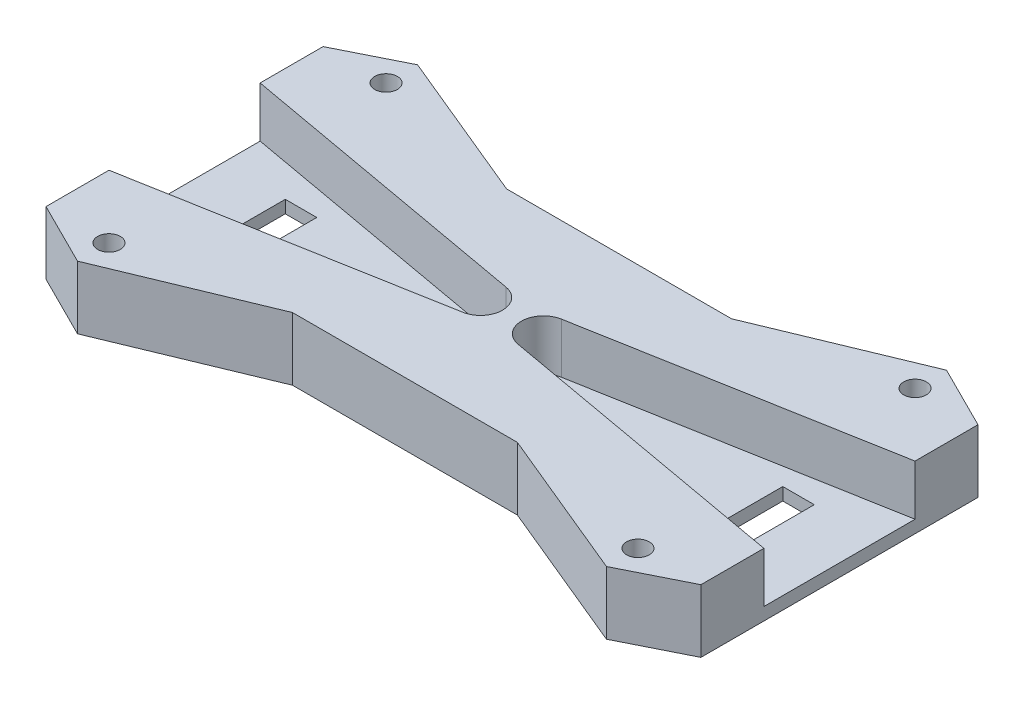
ISO-10303-21;
HEADER;
FILE_DESCRIPTION(('STEP AP214'),'2;1');
FILE_NAME('part.step','',(''),(''),'','','');
FILE_SCHEMA(('AUTOMOTIVE_DESIGN { 1 0 10303 214 1 1 1 1 }'));
ENDSEC;
DATA;
#1=APPLICATION_CONTEXT('core data for automotive mechanical design processes');
#2=APPLICATION_PROTOCOL_DEFINITION('international standard','automotive_design',2000,#1);
#3=PRODUCT_CONTEXT('',#1,'mechanical');
#4=PRODUCT('Part','Part','',(#3));
#5=PRODUCT_RELATED_PRODUCT_CATEGORY('part','',(#4));
#6=PRODUCT_DEFINITION_FORMATION('','',#4);
#7=PRODUCT_DEFINITION_CONTEXT('part definition',#1,'design');
#8=PRODUCT_DEFINITION('design','',#6,#7);
#9=PRODUCT_DEFINITION_SHAPE('','',#8);
#10=(LENGTH_UNIT() NAMED_UNIT(*) SI_UNIT(.MILLI.,.METRE.));
#11=(NAMED_UNIT(*) PLANE_ANGLE_UNIT() SI_UNIT($,.RADIAN.));
#12=(NAMED_UNIT(*) SI_UNIT($,.STERADIAN.) SOLID_ANGLE_UNIT());
#13=UNCERTAINTY_MEASURE_WITH_UNIT(LENGTH_MEASURE(1.E-05),#10,'distance_accuracy_value','');
#14=(GEOMETRIC_REPRESENTATION_CONTEXT(3) GLOBAL_UNCERTAINTY_ASSIGNED_CONTEXT((#13)) GLOBAL_UNIT_ASSIGNED_CONTEXT((#10,
#11,#12)) REPRESENTATION_CONTEXT('',''));
#15=CARTESIAN_POINT('',(0.,0.,0.));
#16=DIRECTION('',(0.,0.,1.));
#17=DIRECTION('',(1.,0.,0.));
#18=AXIS2_PLACEMENT_3D('',#15,#16,#17);
#19=CARTESIAN_POINT('',(-19.2,10.,38.4));
#20=DIRECTION('',(0.447213595499958,0.,-0.894427190999916));
#21=DIRECTION('',(-0.894427190999916,0.,-0.447213595499958));
#22=AXIS2_PLACEMENT_3D('',#19,#20,#21);
#23=PLANE('',#22);
#24=DIRECTION('',(0.894427190999916,0.,0.447213595499958));
#25=VECTOR('',#24,1.);
#26=CARTESIAN_POINT('',(-19.2,0.,38.4));
#27=LINE('',#26,#25);
#28=CARTESIAN_POINT('',(-52.,0.,22.));
#29=VERTEX_POINT('',#28);
#30=CARTESIAN_POINT('',(-42.,0.,27.));
#31=VERTEX_POINT('',#30);
#32=EDGE_CURVE('E341',#29,#31,#27,.T.);
#33=ORIENTED_EDGE('',*,*,#32,.T.);
#34=DIRECTION('',(0.,-1.,0.));
#35=VECTOR('',#34,1.);
#36=CARTESIAN_POINT('',(-42.,10.,27.));
#37=LINE('',#36,#35);
#38=CARTESIAN_POINT('',(-42.,10.,27.));
#39=VERTEX_POINT('',#38);
#40=EDGE_CURVE('E11',#39,#31,#37,.T.);
#41=ORIENTED_EDGE('',*,*,#40,.F.);
#42=DIRECTION('',(0.894427190999916,0.,0.447213595499958));
#43=VECTOR('',#42,1.);
#44=CARTESIAN_POINT('',(-19.2,10.,38.4));
#45=LINE('',#44,#43);
#46=CARTESIAN_POINT('',(-52.,10.,22.));
#47=VERTEX_POINT('',#46);
#48=EDGE_CURVE('E387',#47,#39,#45,.T.);
#49=ORIENTED_EDGE('',*,*,#48,.F.);
#50=DIRECTION('',(0.,-1.,0.));
#51=VECTOR('',#50,1.);
#52=CARTESIAN_POINT('',(-52.,10.,22.));
#53=LINE('',#52,#51);
#54=EDGE_CURVE('E388',#47,#29,#53,.T.);
#55=ORIENTED_EDGE('',*,*,#54,.T.);
#56=EDGE_LOOP('',(#33,#41,#49,#55));
#57=FACE_BOUND('',#56,.T.);
#58=ADVANCED_FACE('F47',(#57),#23,.F.);
#59=CARTESIAN_POINT('',(3.39518395093588,10.,8.19669914110084));
#60=DIRECTION('',(-0.382683432365091,0.,-0.923879532511286));
#61=DIRECTION('',(-0.923879532511287,0.,0.382683432365091));
#62=AXIS2_PLACEMENT_3D('',#59,#60,#61);
#63=PLANE('',#62);
#64=DIRECTION('',(0.923879532511286,0.,-0.382683432365091));
#65=VECTOR('',#64,1.);
#66=CARTESIAN_POINT('',(3.39518395093588,0.,8.19669914110084));
#67=LINE('',#66,#65);
#68=CARTESIAN_POINT('',(-17.8578643762691,0.,17.));
#69=VERTEX_POINT('',#68);
#70=EDGE_CURVE('E331',#31,#69,#67,.T.);
#71=ORIENTED_EDGE('',*,*,#70,.T.);
#72=DIRECTION('',(0.,-1.,0.));
#73=VECTOR('',#72,1.);
#74=CARTESIAN_POINT('',(-17.8578643762691,10.,17.));
#75=LINE('',#74,#73);
#76=CARTESIAN_POINT('',(-17.8578643762691,10.,17.));
#77=VERTEX_POINT('',#76);
#78=EDGE_CURVE('E55',#77,#69,#75,.T.);
#79=ORIENTED_EDGE('',*,*,#78,.F.);
#80=DIRECTION('',(0.923879532511286,0.,-0.382683432365091));
#81=VECTOR('',#80,1.);
#82=CARTESIAN_POINT('',(3.39518395093588,10.,8.19669914110084));
#83=LINE('',#82,#81);
#84=EDGE_CURVE('E451',#39,#77,#83,.T.);
#85=ORIENTED_EDGE('',*,*,#84,.F.);
#86=ORIENTED_EDGE('',*,*,#40,.T.);
#87=EDGE_LOOP('',(#71,#79,#85,#86));
#88=FACE_BOUND('',#87,.T.);
#89=ADVANCED_FACE('F536',(#88),#63,.F.);
#90=CARTESIAN_POINT('',(0.,10.,17.));
#91=DIRECTION('',(0.,0.,-1.));
#92=DIRECTION('',(-1.,0.,0.));
#93=AXIS2_PLACEMENT_3D('',#90,#91,#92);
#94=PLANE('',#93);
#95=DIRECTION('',(1.,0.,0.));
#96=VECTOR('',#95,1.);
#97=CARTESIAN_POINT('',(0.,0.,17.));
#98=LINE('',#97,#96);
#99=CARTESIAN_POINT('',(17.8578643762691,0.,17.));
#100=VERTEX_POINT('',#99);
#101=EDGE_CURVE('E323',#69,#100,#98,.T.);
#102=ORIENTED_EDGE('',*,*,#101,.T.);
#103=DIRECTION('',(0.,-1.,0.));
#104=VECTOR('',#103,1.);
#105=CARTESIAN_POINT('',(17.8578643762691,10.,17.));
#106=LINE('',#105,#104);
#107=CARTESIAN_POINT('',(17.8578643762691,10.,17.));
#108=VERTEX_POINT('',#107);
#109=EDGE_CURVE('E312',#108,#100,#106,.T.);
#110=ORIENTED_EDGE('',*,*,#109,.F.);
#111=DIRECTION('',(1.,0.,0.));
#112=VECTOR('',#111,1.);
#113=CARTESIAN_POINT('',(0.,10.,17.));
#114=LINE('',#113,#112);
#115=EDGE_CURVE('E325',#77,#108,#114,.T.);
#116=ORIENTED_EDGE('',*,*,#115,.F.);
#117=ORIENTED_EDGE('',*,*,#78,.T.);
#118=EDGE_LOOP('',(#102,#110,#116,#117));
#119=FACE_BOUND('',#118,.T.);
#120=ADVANCED_FACE('F321',(#119),#94,.F.);
#121=CARTESIAN_POINT('',(-3.39518395093588,10.,8.19669914110084));
#122=DIRECTION('',(-0.382683432365091,0.,0.923879532511286));
#123=DIRECTION('',(0.923879532511287,0.,0.382683432365091));
#124=AXIS2_PLACEMENT_3D('',#121,#122,#123);
#125=PLANE('',#124);
#126=DIRECTION('',(-0.923879532511286,0.,-0.382683432365091));
#127=VECTOR('',#126,1.);
#128=CARTESIAN_POINT('',(-3.39518395093588,0.,8.19669914110084));
#129=LINE('',#128,#127);
#130=CARTESIAN_POINT('',(42.,0.,27.));
#131=VERTEX_POINT('',#130);
#132=EDGE_CURVE('E334',#131,#100,#129,.T.);
#133=ORIENTED_EDGE('',*,*,#132,.F.);
#134=DIRECTION('',(0.,-1.,0.));
#135=VECTOR('',#134,1.);
#136=CARTESIAN_POINT('',(42.,10.,27.));
#137=LINE('',#136,#135);
#138=CARTESIAN_POINT('',(42.,10.,27.));
#139=VERTEX_POINT('',#138);
#140=EDGE_CURVE('E309',#139,#131,#137,.T.);
#141=ORIENTED_EDGE('',*,*,#140,.F.);
#142=DIRECTION('',(-0.923879532511286,0.,-0.382683432365091));
#143=VECTOR('',#142,1.);
#144=CARTESIAN_POINT('',(-3.39518395093588,10.,8.19669914110084));
#145=LINE('',#144,#143);
#146=EDGE_CURVE('E456',#139,#108,#145,.T.);
#147=ORIENTED_EDGE('',*,*,#146,.T.);
#148=ORIENTED_EDGE('',*,*,#109,.T.);
#149=EDGE_LOOP('',(#133,#141,#147,#148));
#150=FACE_BOUND('',#149,.T.);
#151=ADVANCED_FACE('F534',(#150),#125,.T.);
#152=CARTESIAN_POINT('',(19.2,10.,38.4));
#153=DIRECTION('',(0.447213595499958,0.,0.894427190999916));
#154=DIRECTION('',(0.894427190999916,0.,-0.447213595499958));
#155=AXIS2_PLACEMENT_3D('',#152,#153,#154);
#156=PLANE('',#155);
#157=DIRECTION('',(-0.894427190999916,0.,0.447213595499958));
#158=VECTOR('',#157,1.);
#159=CARTESIAN_POINT('',(19.2,0.,38.4));
#160=LINE('',#159,#158);
#161=CARTESIAN_POINT('',(52.,0.,22.));
#162=VERTEX_POINT('',#161);
#163=EDGE_CURVE('E339',#162,#131,#160,.T.);
#164=ORIENTED_EDGE('',*,*,#163,.F.);
#165=DIRECTION('',(0.,-1.,0.));
#166=VECTOR('',#165,1.);
#167=CARTESIAN_POINT('',(52.,10.,22.));
#168=LINE('',#167,#166);
#169=CARTESIAN_POINT('',(52.,10.,22.));
#170=VERTEX_POINT('',#169);
#171=EDGE_CURVE('E305',#170,#162,#168,.T.);
#172=ORIENTED_EDGE('',*,*,#171,.F.);
#173=DIRECTION('',(-0.894427190999916,0.,0.447213595499958));
#174=VECTOR('',#173,1.);
#175=CARTESIAN_POINT('',(19.2,10.,38.4));
#176=LINE('',#175,#174);
#177=EDGE_CURVE('E460',#170,#139,#176,.T.);
#178=ORIENTED_EDGE('',*,*,#177,.T.);
#179=ORIENTED_EDGE('',*,*,#140,.T.);
#180=EDGE_LOOP('',(#164,#172,#178,#179));
#181=FACE_BOUND('',#180,.T.);
#182=ADVANCED_FACE('F531',(#181),#156,.T.);
#183=CARTESIAN_POINT('',(-0.462556771368066,10.,2.57464029303168));
#184=DIRECTION('',(-0.176827699309656,0.,0.984241822296154));
#185=DIRECTION('',(0.984241822296154,0.,0.176827699309656));
#186=AXIS2_PLACEMENT_3D('',#183,#184,#185);
#187=PLANE('',#186);
#188=DIRECTION('',(0.,-1.,0.));
#189=VECTOR('',#188,1.);
#190=CARTESIAN_POINT('',(52.,10.,12.));
#191=LINE('',#190,#189);
#192=CARTESIAN_POINT('',(52.,10.,12.));
#193=VERTEX_POINT('',#192);
#194=CARTESIAN_POINT('',(52.,2.,12.));
#195=VERTEX_POINT('',#194);
#196=EDGE_CURVE('E62',#193,#195,#191,.T.);
#197=ORIENTED_EDGE('',*,*,#196,.T.);
#198=DIRECTION('',(-0.984241822296154,0.,-0.176827699309656));
#199=VECTOR('',#198,1.);
#200=CARTESIAN_POINT('',(-0.462556771368066,2.,2.57464029303168));
#201=LINE('',#200,#199);
#202=CARTESIAN_POINT('',(4.3811030524162,2.,3.44484637803654));
#203=VERTEX_POINT('',#202);
#204=EDGE_CURVE('E67',#195,#203,#201,.T.);
#205=ORIENTED_EDGE('',*,*,#204,.T.);
#206=DIRECTION('',(0.,-1.,0.));
#207=VECTOR('',#206,1.);
#208=CARTESIAN_POINT('',(4.3811030524162,10.,3.44484637803654));
#209=LINE('',#208,#207);
#210=CARTESIAN_POINT('',(4.3811030524162,10.,3.44484637803654));
#211=VERTEX_POINT('',#210);
#212=EDGE_CURVE('E300',#211,#203,#209,.T.);
#213=ORIENTED_EDGE('',*,*,#212,.F.);
#214=DIRECTION('',(-0.984241822296154,0.,-0.176827699309656));
#215=VECTOR('',#214,1.);
#216=CARTESIAN_POINT('',(-0.462556771368066,10.,2.57464029303168));
#217=LINE('',#216,#215);
#218=EDGE_CURVE('E467',#193,#211,#217,.T.);
#219=ORIENTED_EDGE('',*,*,#218,.F.);
#220=EDGE_LOOP('',(#197,#205,#213,#219));
#221=FACE_BOUND('',#220,.T.);
#222=ADVANCED_FACE('F550',(#221),#187,.F.);
#223=CARTESIAN_POINT('',(5.,10.,0.));
#224=DIRECTION('',(0.,-1.,0.));
#225=DIRECTION('',(0.,0.,-1.));
#226=AXIS2_PLACEMENT_3D('',#223,#224,#225);
#227=CYLINDRICAL_SURFACE('',#226,3.5);
#228=CARTESIAN_POINT('',(5.,2.,0.));
#229=DIRECTION('',(0.,1.,0.));
#230=DIRECTION('',(0.,0.,1.));
#231=AXIS2_PLACEMENT_3D('',#228,#229,#230);
#232=CIRCLE('',#231,3.5);
#233=CARTESIAN_POINT('',(4.3811030524162,2.,-3.44484637803654));
#234=VERTEX_POINT('',#233);
#235=EDGE_CURVE('E949',#234,#203,#232,.T.);
#236=ORIENTED_EDGE('',*,*,#235,.F.);
#237=DIRECTION('',(0.,-1.,0.));
#238=VECTOR('',#237,1.);
#239=CARTESIAN_POINT('',(4.3811030524162,10.,-3.44484637803654));
#240=LINE('',#239,#238);
#241=CARTESIAN_POINT('',(4.3811030524162,10.,-3.44484637803654));
#242=VERTEX_POINT('',#241);
#243=EDGE_CURVE('E296',#242,#234,#240,.T.);
#244=ORIENTED_EDGE('',*,*,#243,.F.);
#245=CARTESIAN_POINT('',(5.,10.,0.));
#246=DIRECTION('',(0.,1.,0.));
#247=DIRECTION('',(0.,0.,1.));
#248=AXIS2_PLACEMENT_3D('',#245,#246,#247);
#249=CIRCLE('',#248,3.5);
#250=EDGE_CURVE('E471',#242,#211,#249,.T.);
#251=ORIENTED_EDGE('',*,*,#250,.T.);
#252=ORIENTED_EDGE('',*,*,#212,.T.);
#253=EDGE_LOOP('',(#236,#244,#251,#252));
#254=FACE_BOUND('',#253,.T.);
#255=ADVANCED_FACE('F553',(#254),#227,.F.);
#256=CARTESIAN_POINT('',(-0.462556771368066,10.,-2.57464029303168));
#257=DIRECTION('',(0.176827699309656,0.,0.984241822296154));
#258=DIRECTION('',(0.984241822296154,0.,-0.176827699309656));
#259=AXIS2_PLACEMENT_3D('',#256,#257,#258);
#260=PLANE('',#259);
#261=DIRECTION('',(-0.984241822296154,0.,0.176827699309656));
#262=VECTOR('',#261,1.);
#263=CARTESIAN_POINT('',(-0.462556771368066,2.,-2.57464029303168));
#264=LINE('',#263,#262);
#265=CARTESIAN_POINT('',(52.,2.,-12.));
#266=VERTEX_POINT('',#265);
#267=EDGE_CURVE('E945',#266,#234,#264,.T.);
#268=ORIENTED_EDGE('',*,*,#267,.F.);
#269=DIRECTION('',(0.,-1.,0.));
#270=VECTOR('',#269,1.);
#271=CARTESIAN_POINT('',(52.,10.,-12.));
#272=LINE('',#271,#270);
#273=CARTESIAN_POINT('',(52.,10.,-12.));
#274=VERTEX_POINT('',#273);
#275=EDGE_CURVE('E292',#274,#266,#272,.T.);
#276=ORIENTED_EDGE('',*,*,#275,.F.);
#277=DIRECTION('',(-0.984241822296154,0.,0.176827699309656));
#278=VECTOR('',#277,1.);
#279=CARTESIAN_POINT('',(-0.462556771368066,10.,-2.57464029303168));
#280=LINE('',#279,#278);
#281=EDGE_CURVE('E475',#274,#242,#280,.T.);
#282=ORIENTED_EDGE('',*,*,#281,.T.);
#283=ORIENTED_EDGE('',*,*,#243,.T.);
#284=EDGE_LOOP('',(#268,#276,#282,#283));
#285=FACE_BOUND('',#284,.T.);
#286=ADVANCED_FACE('F556',(#285),#260,.T.);
#287=CARTESIAN_POINT('',(52.,10.,0.));
#288=DIRECTION('',(-1.,0.,0.));
#289=DIRECTION('',(0.,0.,1.));
#290=AXIS2_PLACEMENT_3D('',#287,#288,#289);
#291=PLANE('',#290);
#292=DIRECTION('',(0.,0.,-1.));
#293=VECTOR('',#292,1.);
#294=CARTESIAN_POINT('',(52.,0.,0.));
#295=LINE('',#294,#293);
#296=CARTESIAN_POINT('',(52.,0.,-22.));
#297=VERTEX_POINT('',#296);
#298=EDGE_CURVE('E347',#162,#297,#295,.T.);
#299=ORIENTED_EDGE('',*,*,#298,.T.);
#300=DIRECTION('',(0.,-1.,0.));
#301=VECTOR('',#300,1.);
#302=CARTESIAN_POINT('',(52.,10.,-22.));
#303=LINE('',#302,#301);
#304=CARTESIAN_POINT('',(52.,10.,-22.));
#305=VERTEX_POINT('',#304);
#306=EDGE_CURVE('E288',#305,#297,#303,.T.);
#307=ORIENTED_EDGE('',*,*,#306,.F.);
#308=DIRECTION('',(0.,0.,-1.));
#309=VECTOR('',#308,1.);
#310=CARTESIAN_POINT('',(52.,10.,0.));
#311=LINE('',#310,#309);
#312=EDGE_CURVE('E468',#274,#305,#311,.T.);
#313=ORIENTED_EDGE('',*,*,#312,.F.);
#314=ORIENTED_EDGE('',*,*,#275,.T.);
#315=DIRECTION('',(0.,0.,-1.));
#316=VECTOR('',#315,1.);
#317=CARTESIAN_POINT('',(52.,2.,0.));
#318=LINE('',#317,#316);
#319=EDGE_CURVE('E955',#195,#266,#318,.T.);
#320=ORIENTED_EDGE('',*,*,#319,.F.);
#321=ORIENTED_EDGE('',*,*,#196,.F.);
#322=EDGE_CURVE('E464',#170,#193,#311,.T.);
#323=ORIENTED_EDGE('',*,*,#322,.F.);
#324=ORIENTED_EDGE('',*,*,#171,.T.);
#325=EDGE_LOOP('',(#299,#307,#313,#314,#320,#321,#323,#324));
#326=FACE_BOUND('',#325,.T.);
#327=ADVANCED_FACE('F525',(#326),#291,.F.);
#328=CARTESIAN_POINT('',(19.2,10.,-38.4));
#329=DIRECTION('',(-0.447213595499958,0.,0.894427190999916));
#330=DIRECTION('',(0.894427190999916,0.,0.447213595499958));
#331=AXIS2_PLACEMENT_3D('',#328,#329,#330);
#332=PLANE('',#331);
#333=DIRECTION('',(-0.894427190999916,0.,-0.447213595499958));
#334=VECTOR('',#333,1.);
#335=CARTESIAN_POINT('',(19.2,0.,-38.4));
#336=LINE('',#335,#334);
#337=CARTESIAN_POINT('',(42.,0.,-27.));
#338=VERTEX_POINT('',#337);
#339=EDGE_CURVE('E350',#297,#338,#336,.T.);
#340=ORIENTED_EDGE('',*,*,#339,.T.);
#341=DIRECTION('',(0.,-1.,0.));
#342=VECTOR('',#341,1.);
#343=CARTESIAN_POINT('',(42.,10.,-27.));
#344=LINE('',#343,#342);
#345=CARTESIAN_POINT('',(42.,10.,-27.));
#346=VERTEX_POINT('',#345);
#347=EDGE_CURVE('E284',#346,#338,#344,.T.);
#348=ORIENTED_EDGE('',*,*,#347,.F.);
#349=DIRECTION('',(-0.894427190999916,0.,-0.447213595499958));
#350=VECTOR('',#349,1.);
#351=CARTESIAN_POINT('',(19.2,10.,-38.4));
#352=LINE('',#351,#350);
#353=EDGE_CURVE('E479',#305,#346,#352,.T.);
#354=ORIENTED_EDGE('',*,*,#353,.F.);
#355=ORIENTED_EDGE('',*,*,#306,.T.);
#356=EDGE_LOOP('',(#340,#348,#354,#355));
#357=FACE_BOUND('',#356,.T.);
#358=ADVANCED_FACE('F520',(#357),#332,.F.);
#359=CARTESIAN_POINT('',(-3.39518395093588,10.,-8.19669914110084));
#360=DIRECTION('',(0.382683432365091,0.,0.923879532511286));
#361=DIRECTION('',(0.923879532511287,0.,-0.382683432365091));
#362=AXIS2_PLACEMENT_3D('',#359,#360,#361);
#363=PLANE('',#362);
#364=DIRECTION('',(-0.923879532511286,0.,0.382683432365091));
#365=VECTOR('',#364,1.);
#366=CARTESIAN_POINT('',(-3.39518395093588,0.,-8.19669914110084));
#367=LINE('',#366,#365);
#368=CARTESIAN_POINT('',(17.8578643762691,0.,-17.));
#369=VERTEX_POINT('',#368);
#370=EDGE_CURVE('E353',#338,#369,#367,.T.);
#371=ORIENTED_EDGE('',*,*,#370,.T.);
#372=DIRECTION('',(0.,-1.,0.));
#373=VECTOR('',#372,1.);
#374=CARTESIAN_POINT('',(17.8578643762691,10.,-17.));
#375=LINE('',#374,#373);
#376=CARTESIAN_POINT('',(17.8578643762691,10.,-17.));
#377=VERTEX_POINT('',#376);
#378=EDGE_CURVE('E280',#377,#369,#375,.T.);
#379=ORIENTED_EDGE('',*,*,#378,.F.);
#380=DIRECTION('',(-0.923879532511286,0.,0.382683432365091));
#381=VECTOR('',#380,1.);
#382=CARTESIAN_POINT('',(-3.39518395093588,10.,-8.19669914110084));
#383=LINE('',#382,#381);
#384=EDGE_CURVE('E482',#346,#377,#383,.T.);
#385=ORIENTED_EDGE('',*,*,#384,.F.);
#386=ORIENTED_EDGE('',*,*,#347,.T.);
#387=EDGE_LOOP('',(#371,#379,#385,#386));
#388=FACE_BOUND('',#387,.T.);
#389=ADVANCED_FACE('F516',(#388),#363,.F.);
#390=CARTESIAN_POINT('',(0.,10.,-17.));
#391=DIRECTION('',(0.,0.,1.));
#392=DIRECTION('',(1.,0.,0.));
#393=AXIS2_PLACEMENT_3D('',#390,#391,#392);
#394=PLANE('',#393);
#395=DIRECTION('',(-1.,0.,0.));
#396=VECTOR('',#395,1.);
#397=CARTESIAN_POINT('',(0.,0.,-17.));
#398=LINE('',#397,#396);
#399=CARTESIAN_POINT('',(-17.8578643762691,0.,-17.));
#400=VERTEX_POINT('',#399);
#401=EDGE_CURVE('E356',#369,#400,#398,.T.);
#402=ORIENTED_EDGE('',*,*,#401,.T.);
#403=DIRECTION('',(0.,-1.,0.));
#404=VECTOR('',#403,1.);
#405=CARTESIAN_POINT('',(-17.8578643762691,10.,-17.));
#406=LINE('',#405,#404);
#407=CARTESIAN_POINT('',(-17.8578643762691,10.,-17.));
#408=VERTEX_POINT('',#407);
#409=EDGE_CURVE('E277',#408,#400,#406,.T.);
#410=ORIENTED_EDGE('',*,*,#409,.F.);
#411=DIRECTION('',(-1.,0.,0.));
#412=VECTOR('',#411,1.);
#413=CARTESIAN_POINT('',(0.,10.,-17.));
#414=LINE('',#413,#412);
#415=EDGE_CURVE('E485',#377,#408,#414,.T.);
#416=ORIENTED_EDGE('',*,*,#415,.F.);
#417=ORIENTED_EDGE('',*,*,#378,.T.);
#418=EDGE_LOOP('',(#402,#410,#416,#417));
#419=FACE_BOUND('',#418,.T.);
#420=ADVANCED_FACE('F512',(#419),#394,.F.);
#421=CARTESIAN_POINT('',(3.39518395093588,10.,-8.19669914110084));
#422=DIRECTION('',(0.382683432365091,0.,-0.923879532511286));
#423=DIRECTION('',(-0.923879532511287,0.,-0.382683432365091));
#424=AXIS2_PLACEMENT_3D('',#421,#422,#423);
#425=PLANE('',#424);
#426=DIRECTION('',(0.923879532511286,0.,0.382683432365091));
#427=VECTOR('',#426,1.);
#428=CARTESIAN_POINT('',(3.39518395093588,0.,-8.19669914110084));
#429=LINE('',#428,#427);
#430=CARTESIAN_POINT('',(-42.,0.,-27.));
#431=VERTEX_POINT('',#430);
#432=EDGE_CURVE('E360',#431,#400,#429,.T.);
#433=ORIENTED_EDGE('',*,*,#432,.F.);
#434=DIRECTION('',(0.,-1.,0.));
#435=VECTOR('',#434,1.);
#436=CARTESIAN_POINT('',(-42.,10.,-27.));
#437=LINE('',#436,#435);
#438=CARTESIAN_POINT('',(-42.,10.,-27.));
#439=VERTEX_POINT('',#438);
#440=EDGE_CURVE('E274',#439,#431,#437,.T.);
#441=ORIENTED_EDGE('',*,*,#440,.F.);
#442=DIRECTION('',(0.923879532511286,0.,0.382683432365091));
#443=VECTOR('',#442,1.);
#444=CARTESIAN_POINT('',(3.39518395093588,10.,-8.19669914110084));
#445=LINE('',#444,#443);
#446=EDGE_CURVE('E488',#439,#408,#445,.T.);
#447=ORIENTED_EDGE('',*,*,#446,.T.);
#448=ORIENTED_EDGE('',*,*,#409,.T.);
#449=EDGE_LOOP('',(#433,#441,#447,#448));
#450=FACE_BOUND('',#449,.T.);
#451=ADVANCED_FACE('F508',(#450),#425,.T.);
#452=CARTESIAN_POINT('',(-19.2,10.,-38.4));
#453=DIRECTION('',(-0.447213595499958,0.,-0.894427190999916));
#454=DIRECTION('',(-0.894427190999916,0.,0.447213595499958));
#455=AXIS2_PLACEMENT_3D('',#452,#453,#454);
#456=PLANE('',#455);
#457=DIRECTION('',(0.894427190999916,0.,-0.447213595499958));
#458=VECTOR('',#457,1.);
#459=CARTESIAN_POINT('',(-19.2,0.,-38.4));
#460=LINE('',#459,#458);
#461=CARTESIAN_POINT('',(-52.,0.,-22.));
#462=VERTEX_POINT('',#461);
#463=EDGE_CURVE('E364',#462,#431,#460,.T.);
#464=ORIENTED_EDGE('',*,*,#463,.F.);
#465=DIRECTION('',(0.,-1.,0.));
#466=VECTOR('',#465,1.);
#467=CARTESIAN_POINT('',(-52.,10.,-22.));
#468=LINE('',#467,#466);
#469=CARTESIAN_POINT('',(-52.,10.,-22.));
#470=VERTEX_POINT('',#469);
#471=EDGE_CURVE('E265',#470,#462,#468,.T.);
#472=ORIENTED_EDGE('',*,*,#471,.F.);
#473=DIRECTION('',(0.894427190999916,0.,-0.447213595499958));
#474=VECTOR('',#473,1.);
#475=CARTESIAN_POINT('',(-19.2,10.,-38.4));
#476=LINE('',#475,#474);
#477=EDGE_CURVE('E492',#470,#439,#476,.T.);
#478=ORIENTED_EDGE('',*,*,#477,.T.);
#479=ORIENTED_EDGE('',*,*,#440,.T.);
#480=EDGE_LOOP('',(#464,#472,#478,#479));
#481=FACE_BOUND('',#480,.T.);
#482=ADVANCED_FACE('F503',(#481),#456,.T.);
#483=CARTESIAN_POINT('',(0.462556771368066,10.,-2.57464029303168));
#484=DIRECTION('',(0.176827699309656,0.,-0.984241822296154));
#485=DIRECTION('',(-0.984241822296154,0.,-0.176827699309656));
#486=AXIS2_PLACEMENT_3D('',#483,#484,#485);
#487=PLANE('',#486);
#488=DIRECTION('',(0.,-1.,0.));
#489=VECTOR('',#488,1.);
#490=CARTESIAN_POINT('',(-52.,10.,-12.));
#491=LINE('',#490,#489);
#492=CARTESIAN_POINT('',(-52.,10.,-12.));
#493=VERTEX_POINT('',#492);
#494=CARTESIAN_POINT('',(-52.,2.,-12.));
#495=VERTEX_POINT('',#494);
#496=EDGE_CURVE('E254',#493,#495,#491,.T.);
#497=ORIENTED_EDGE('',*,*,#496,.T.);
#498=DIRECTION('',(0.984241822296154,0.,0.176827699309656));
#499=VECTOR('',#498,1.);
#500=CARTESIAN_POINT('',(0.462556771368066,2.,-2.57464029303168));
#501=LINE('',#500,#499);
#502=CARTESIAN_POINT('',(-4.3811030524162,2.,-3.44484637803654));
#503=VERTEX_POINT('',#502);
#504=EDGE_CURVE('E236',#495,#503,#501,.T.);
#505=ORIENTED_EDGE('',*,*,#504,.T.);
#506=DIRECTION('',(0.,-1.,0.));
#507=VECTOR('',#506,1.);
#508=CARTESIAN_POINT('',(-4.3811030524162,10.,-3.44484637803654));
#509=LINE('',#508,#507);
#510=CARTESIAN_POINT('',(-4.3811030524162,10.,-3.44484637803654));
#511=VERTEX_POINT('',#510);
#512=EDGE_CURVE('E252',#511,#503,#509,.T.);
#513=ORIENTED_EDGE('',*,*,#512,.F.);
#514=DIRECTION('',(0.984241822296154,0.,0.176827699309656));
#515=VECTOR('',#514,1.);
#516=CARTESIAN_POINT('',(0.462556771368066,10.,-2.57464029303168));
#517=LINE('',#516,#515);
#518=EDGE_CURVE('E415',#493,#511,#517,.T.);
#519=ORIENTED_EDGE('',*,*,#518,.F.);
#520=EDGE_LOOP('',(#497,#505,#513,#519));
#521=FACE_BOUND('',#520,.T.);
#522=ADVANCED_FACE('F250',(#521),#487,.F.);
#523=CARTESIAN_POINT('',(-5.,10.,0.));
#524=DIRECTION('',(0.,-1.,0.));
#525=DIRECTION('',(0.,0.,-1.));
#526=AXIS2_PLACEMENT_3D('',#523,#524,#525);
#527=CYLINDRICAL_SURFACE('',#526,3.5);
#528=ORIENTED_EDGE('',*,*,#512,.T.);
#529=CARTESIAN_POINT('',(-5.,2.,0.));
#530=DIRECTION('',(0.,1.,0.));
#531=DIRECTION('',(0.,0.,1.));
#532=AXIS2_PLACEMENT_3D('',#529,#530,#531);
#533=CIRCLE('',#532,3.5);
#534=CARTESIAN_POINT('',(-4.3811030524162,2.,3.44484637803654));
#535=VERTEX_POINT('',#534);
#536=EDGE_CURVE('E232',#503,#535,#533,.F.);
#537=ORIENTED_EDGE('',*,*,#536,.T.);
#538=DIRECTION('',(0.,-1.,0.));
#539=VECTOR('',#538,1.);
#540=CARTESIAN_POINT('',(-4.3811030524162,10.,3.44484637803654));
#541=LINE('',#540,#539);
#542=CARTESIAN_POINT('',(-4.3811030524162,10.,3.44484637803654));
#543=VERTEX_POINT('',#542);
#544=EDGE_CURVE('E261',#543,#535,#541,.T.);
#545=ORIENTED_EDGE('',*,*,#544,.F.);
#546=CARTESIAN_POINT('',(-5.,10.,0.));
#547=DIRECTION('',(0.,1.,0.));
#548=DIRECTION('',(0.,0.,1.));
#549=AXIS2_PLACEMENT_3D('',#546,#547,#548);
#550=CIRCLE('',#549,3.5);
#551=EDGE_CURVE('E259',#511,#543,#550,.F.);
#552=ORIENTED_EDGE('',*,*,#551,.F.);
#553=EDGE_LOOP('',(#528,#537,#545,#552));
#554=FACE_BOUND('',#553,.T.);
#555=ADVANCED_FACE('F258',(#554),#527,.F.);
#556=CARTESIAN_POINT('',(0.462556771368066,10.,2.57464029303168));
#557=DIRECTION('',(-0.176827699309656,0.,-0.984241822296154));
#558=DIRECTION('',(-0.984241822296154,0.,0.176827699309656));
#559=AXIS2_PLACEMENT_3D('',#556,#557,#558);
#560=PLANE('',#559);
#561=DIRECTION('',(0.984241822296154,0.,-0.176827699309656));
#562=VECTOR('',#561,1.);
#563=CARTESIAN_POINT('',(0.462556771368066,2.,2.57464029303168));
#564=LINE('',#563,#562);
#565=CARTESIAN_POINT('',(-52.,2.,12.));
#566=VERTEX_POINT('',#565);
#567=EDGE_CURVE('E239',#566,#535,#564,.T.);
#568=ORIENTED_EDGE('',*,*,#567,.F.);
#569=DIRECTION('',(0.,-1.,0.));
#570=VECTOR('',#569,1.);
#571=CARTESIAN_POINT('',(-52.,10.,12.));
#572=LINE('',#571,#570);
#573=CARTESIAN_POINT('',(-52.,10.,12.));
#574=VERTEX_POINT('',#573);
#575=EDGE_CURVE('E267',#574,#566,#572,.T.);
#576=ORIENTED_EDGE('',*,*,#575,.F.);
#577=DIRECTION('',(0.984241822296154,0.,-0.176827699309656));
#578=VECTOR('',#577,1.);
#579=CARTESIAN_POINT('',(0.462556771368066,10.,2.57464029303168));
#580=LINE('',#579,#578);
#581=EDGE_CURVE('E403',#574,#543,#580,.T.);
#582=ORIENTED_EDGE('',*,*,#581,.T.);
#583=ORIENTED_EDGE('',*,*,#544,.T.);
#584=EDGE_LOOP('',(#568,#576,#582,#583));
#585=FACE_BOUND('',#584,.T.);
#586=ADVANCED_FACE('F402',(#585),#560,.T.);
#587=CARTESIAN_POINT('',(42.,10.,22.));
#588=DIRECTION('',(0.,-1.,0.));
#589=DIRECTION('',(0.,0.,-1.));
#590=AXIS2_PLACEMENT_3D('',#587,#588,#589);
#591=CYLINDRICAL_SURFACE('',#590,1.8);
#592=CARTESIAN_POINT('',(42.,10.,22.));
#593=DIRECTION('',(0.,1.,0.));
#594=DIRECTION('',(0.,0.,1.));
#595=AXIS2_PLACEMENT_3D('',#592,#593,#594);
#596=CIRCLE('',#595,1.8);
#597=CARTESIAN_POINT('',(42.,10.,23.8));
#598=VERTEX_POINT('',#597);
#599=EDGE_CURVE('E426',#598,#598,#596,.T.);
#600=ORIENTED_EDGE('',*,*,#599,.T.);
#601=EDGE_LOOP('',(#600));
#602=FACE_BOUND('',#601,.T.);
#603=CARTESIAN_POINT('',(42.,0.,22.));
#604=DIRECTION('',(0.,1.,0.));
#605=DIRECTION('',(0.,0.,1.));
#606=AXIS2_PLACEMENT_3D('',#603,#604,#605);
#607=CIRCLE('',#606,1.8);
#608=CARTESIAN_POINT('',(42.,0.,23.8));
#609=VERTEX_POINT('',#608);
#610=EDGE_CURVE('E379',#609,#609,#607,.T.);
#611=ORIENTED_EDGE('',*,*,#610,.F.);
#612=EDGE_LOOP('',(#611));
#613=FACE_BOUND('',#612,.T.);
#614=ADVANCED_FACE('F579',(#602,#613),#591,.F.);
#615=CARTESIAN_POINT('',(42.,10.,-22.));
#616=DIRECTION('',(0.,-1.,0.));
#617=DIRECTION('',(0.,0.,-1.));
#618=AXIS2_PLACEMENT_3D('',#615,#616,#617);
#619=CYLINDRICAL_SURFACE('',#618,1.8);
#620=CARTESIAN_POINT('',(42.,10.,-22.));
#621=DIRECTION('',(0.,1.,0.));
#622=DIRECTION('',(0.,0.,1.));
#623=AXIS2_PLACEMENT_3D('',#620,#621,#622);
#624=CIRCLE('',#623,1.8);
#625=CARTESIAN_POINT('',(42.,10.,-20.2));
#626=VERTEX_POINT('',#625);
#627=EDGE_CURVE('E422',#626,#626,#624,.T.);
#628=ORIENTED_EDGE('',*,*,#627,.T.);
#629=EDGE_LOOP('',(#628));
#630=FACE_BOUND('',#629,.T.);
#631=CARTESIAN_POINT('',(42.,0.,-22.));
#632=DIRECTION('',(0.,1.,0.));
#633=DIRECTION('',(0.,0.,1.));
#634=AXIS2_PLACEMENT_3D('',#631,#632,#633);
#635=CIRCLE('',#634,1.8);
#636=CARTESIAN_POINT('',(42.,0.,-20.2));
#637=VERTEX_POINT('',#636);
#638=EDGE_CURVE('E375',#637,#637,#635,.T.);
#639=ORIENTED_EDGE('',*,*,#638,.F.);
#640=EDGE_LOOP('',(#639));
#641=FACE_BOUND('',#640,.T.);
#642=ADVANCED_FACE('F586',(#630,#641),#619,.F.);
#643=CARTESIAN_POINT('',(-42.,10.,-22.));
#644=DIRECTION('',(0.,-1.,0.));
#645=DIRECTION('',(0.,0.,-1.));
#646=AXIS2_PLACEMENT_3D('',#643,#644,#645);
#647=CYLINDRICAL_SURFACE('',#646,1.79999999999999);
#648=CARTESIAN_POINT('',(-42.,10.,-22.));
#649=DIRECTION('',(0.,1.,0.));
#650=DIRECTION('',(0.,0.,1.));
#651=AXIS2_PLACEMENT_3D('',#648,#649,#650);
#652=CIRCLE('',#651,1.79999999999999);
#653=CARTESIAN_POINT('',(-42.,10.,-20.2));
#654=VERTEX_POINT('',#653);
#655=EDGE_CURVE('E412',#654,#654,#652,.T.);
#656=ORIENTED_EDGE('',*,*,#655,.T.);
#657=EDGE_LOOP('',(#656));
#658=FACE_BOUND('',#657,.T.);
#659=CARTESIAN_POINT('',(-42.,0.,-22.));
#660=DIRECTION('',(0.,1.,0.));
#661=DIRECTION('',(0.,0.,1.));
#662=AXIS2_PLACEMENT_3D('',#659,#660,#661);
#663=CIRCLE('',#662,1.79999999999999);
#664=CARTESIAN_POINT('',(-42.,0.,-20.2));
#665=VERTEX_POINT('',#664);
#666=EDGE_CURVE('E371',#665,#665,#663,.T.);
#667=ORIENTED_EDGE('',*,*,#666,.F.);
#668=EDGE_LOOP('',(#667));
#669=FACE_BOUND('',#668,.T.);
#670=ADVANCED_FACE('F583',(#658,#669),#647,.F.);
#671=CARTESIAN_POINT('',(-52.,10.,0.));
#672=DIRECTION('',(-1.,0.,0.));
#673=DIRECTION('',(0.,0.,1.));
#674=AXIS2_PLACEMENT_3D('',#671,#672,#673);
#675=PLANE('',#674);
#676=DIRECTION('',(0.,0.,-1.));
#677=VECTOR('',#676,1.);
#678=CARTESIAN_POINT('',(-52.,0.,0.));
#679=LINE('',#678,#677);
#680=EDGE_CURVE('E368',#29,#462,#679,.T.);
#681=ORIENTED_EDGE('',*,*,#680,.F.);
#682=ORIENTED_EDGE('',*,*,#54,.F.);
#683=DIRECTION('',(0.,0.,-1.));
#684=VECTOR('',#683,1.);
#685=CARTESIAN_POINT('',(-52.,10.,0.));
#686=LINE('',#685,#684);
#687=EDGE_CURVE('E398',#47,#574,#686,.T.);
#688=ORIENTED_EDGE('',*,*,#687,.T.);
#689=ORIENTED_EDGE('',*,*,#575,.T.);
#690=DIRECTION('',(0.,0.,-1.));
#691=VECTOR('',#690,1.);
#692=CARTESIAN_POINT('',(-52.,2.,0.));
#693=LINE('',#692,#691);
#694=EDGE_CURVE('E256',#566,#495,#693,.T.);
#695=ORIENTED_EDGE('',*,*,#694,.T.);
#696=ORIENTED_EDGE('',*,*,#496,.F.);
#697=EDGE_CURVE('E414',#493,#470,#686,.T.);
#698=ORIENTED_EDGE('',*,*,#697,.T.);
#699=ORIENTED_EDGE('',*,*,#471,.T.);
#700=EDGE_LOOP('',(#681,#682,#688,#689,#695,#696,#698,#699));
#701=FACE_BOUND('',#700,.T.);
#702=ADVANCED_FACE('F396',(#701),#675,.T.);
#703=CARTESIAN_POINT('',(-42.,10.,22.));
#704=DIRECTION('',(0.,-1.,0.));
#705=DIRECTION('',(0.,0.,-1.));
#706=AXIS2_PLACEMENT_3D('',#703,#704,#705);
#707=CYLINDRICAL_SURFACE('',#706,1.8);
#708=CARTESIAN_POINT('',(-42.,10.,22.));
#709=DIRECTION('',(0.,1.,0.));
#710=DIRECTION('',(0.,0.,1.));
#711=AXIS2_PLACEMENT_3D('',#708,#709,#710);
#712=CIRCLE('',#711,1.8);
#713=CARTESIAN_POINT('',(-42.,10.,23.8));
#714=VERTEX_POINT('',#713);
#715=EDGE_CURVE('E390',#714,#714,#712,.T.);
#716=ORIENTED_EDGE('',*,*,#715,.T.);
#717=EDGE_LOOP('',(#716));
#718=FACE_BOUND('',#717,.T.);
#719=CARTESIAN_POINT('',(-42.,0.,22.));
#720=DIRECTION('',(0.,1.,0.));
#721=DIRECTION('',(0.,0.,1.));
#722=AXIS2_PLACEMENT_3D('',#719,#720,#721);
#723=CIRCLE('',#722,1.8);
#724=CARTESIAN_POINT('',(-42.,0.,23.8));
#725=VERTEX_POINT('',#724);
#726=EDGE_CURVE('E383',#725,#725,#723,.T.);
#727=ORIENTED_EDGE('',*,*,#726,.F.);
#728=EDGE_LOOP('',(#727));
#729=FACE_BOUND('',#728,.T.);
#730=ADVANCED_FACE('F582',(#718,#729),#707,.F.);
#731=CARTESIAN_POINT('',(0.,10.,0.));
#732=DIRECTION('',(0.,1.,0.));
#733=DIRECTION('',(0.,0.,1.));
#734=AXIS2_PLACEMENT_3D('',#731,#732,#733);
#735=PLANE('',#734);
#736=ORIENTED_EDGE('',*,*,#48,.T.);
#737=ORIENTED_EDGE('',*,*,#84,.T.);
#738=ORIENTED_EDGE('',*,*,#115,.T.);
#739=ORIENTED_EDGE('',*,*,#146,.F.);
#740=ORIENTED_EDGE('',*,*,#177,.F.);
#741=ORIENTED_EDGE('',*,*,#322,.T.);
#742=ORIENTED_EDGE('',*,*,#218,.T.);
#743=ORIENTED_EDGE('',*,*,#250,.F.);
#744=ORIENTED_EDGE('',*,*,#281,.F.);
#745=ORIENTED_EDGE('',*,*,#312,.T.);
#746=ORIENTED_EDGE('',*,*,#353,.T.);
#747=ORIENTED_EDGE('',*,*,#384,.T.);
#748=ORIENTED_EDGE('',*,*,#415,.T.);
#749=ORIENTED_EDGE('',*,*,#446,.F.);
#750=ORIENTED_EDGE('',*,*,#477,.F.);
#751=ORIENTED_EDGE('',*,*,#697,.F.);
#752=ORIENTED_EDGE('',*,*,#518,.T.);
#753=ORIENTED_EDGE('',*,*,#551,.T.);
#754=ORIENTED_EDGE('',*,*,#581,.F.);
#755=ORIENTED_EDGE('',*,*,#687,.F.);
#756=EDGE_LOOP('',(#736,#737,#738,#739,#740,#741,#742,#743,#744,#745,#746,#747,#748,#749,#750,
#751,#752,#753,#754,#755));
#757=FACE_BOUND('',#756,.T.);
#758=ORIENTED_EDGE('',*,*,#655,.F.);
#759=EDGE_LOOP('',(#758));
#760=FACE_BOUND('',#759,.T.);
#761=ORIENTED_EDGE('',*,*,#627,.F.);
#762=EDGE_LOOP('',(#761));
#763=FACE_BOUND('',#762,.T.);
#764=ORIENTED_EDGE('',*,*,#599,.F.);
#765=EDGE_LOOP('',(#764));
#766=FACE_BOUND('',#765,.T.);
#767=ORIENTED_EDGE('',*,*,#715,.F.);
#768=EDGE_LOOP('',(#767));
#769=FACE_BOUND('',#768,.T.);
#770=ADVANCED_FACE('F406',(#757,#760,#763,#766,#769),#735,.T.);
#771=CARTESIAN_POINT('',(0.,0.,0.));
#772=DIRECTION('',(0.,1.,0.));
#773=DIRECTION('',(0.,0.,1.));
#774=AXIS2_PLACEMENT_3D('',#771,#772,#773);
#775=PLANE('',#774);
#776=ORIENTED_EDGE('',*,*,#32,.F.);
#777=ORIENTED_EDGE('',*,*,#680,.T.);
#778=ORIENTED_EDGE('',*,*,#463,.T.);
#779=ORIENTED_EDGE('',*,*,#432,.T.);
#780=ORIENTED_EDGE('',*,*,#401,.F.);
#781=ORIENTED_EDGE('',*,*,#370,.F.);
#782=ORIENTED_EDGE('',*,*,#339,.F.);
#783=ORIENTED_EDGE('',*,*,#298,.F.);
#784=ORIENTED_EDGE('',*,*,#163,.T.);
#785=ORIENTED_EDGE('',*,*,#132,.T.);
#786=ORIENTED_EDGE('',*,*,#101,.F.);
#787=ORIENTED_EDGE('',*,*,#70,.F.);
#788=EDGE_LOOP('',(#776,#777,#778,#779,#780,#781,#782,#783,#784,#785,#786,#787));
#789=FACE_BOUND('',#788,.T.);
#790=ORIENTED_EDGE('',*,*,#666,.T.);
#791=EDGE_LOOP('',(#790));
#792=FACE_BOUND('',#791,.T.);
#793=ORIENTED_EDGE('',*,*,#638,.T.);
#794=EDGE_LOOP('',(#793));
#795=FACE_BOUND('',#794,.T.);
#796=ORIENTED_EDGE('',*,*,#610,.T.);
#797=EDGE_LOOP('',(#796));
#798=FACE_BOUND('',#797,.T.);
#799=ORIENTED_EDGE('',*,*,#726,.T.);
#800=EDGE_LOOP('',(#799));
#801=FACE_BOUND('',#800,.T.);
#802=DIRECTION('',(0.,0.,-1.));
#803=VECTOR('',#802,1.);
#804=CARTESIAN_POINT('',(42.,0.,0.));
#805=LINE('',#804,#803);
#806=CARTESIAN_POINT('',(42.,0.,6.));
#807=VERTEX_POINT('',#806);
#808=CARTESIAN_POINT('',(42.,0.,-6.));
#809=VERTEX_POINT('',#808);
#810=EDGE_CURVE('E928',#807,#809,#805,.T.);
#811=ORIENTED_EDGE('',*,*,#810,.T.);
#812=DIRECTION('',(-1.,0.,0.));
#813=VECTOR('',#812,1.);
#814=CARTESIAN_POINT('',(0.,0.,-6.));
#815=LINE('',#814,#813);
#816=CARTESIAN_POINT('',(37.,0.,-6.));
#817=VERTEX_POINT('',#816);
#818=EDGE_CURVE('E934',#809,#817,#815,.T.);
#819=ORIENTED_EDGE('',*,*,#818,.T.);
#820=DIRECTION('',(0.,0.,1.));
#821=VECTOR('',#820,1.);
#822=CARTESIAN_POINT('',(37.,0.,0.));
#823=LINE('',#822,#821);
#824=CARTESIAN_POINT('',(37.,0.,6.));
#825=VERTEX_POINT('',#824);
#826=EDGE_CURVE('E967',#817,#825,#823,.T.);
#827=ORIENTED_EDGE('',*,*,#826,.T.);
#828=DIRECTION('',(1.,0.,0.));
#829=VECTOR('',#828,1.);
#830=CARTESIAN_POINT('',(0.,0.,6.));
#831=LINE('',#830,#829);
#832=EDGE_CURVE('E963',#825,#807,#831,.T.);
#833=ORIENTED_EDGE('',*,*,#832,.T.);
#834=EDGE_LOOP('',(#811,#819,#827,#833));
#835=FACE_BOUND('',#834,.T.);
#836=DIRECTION('',(-1.,0.,0.));
#837=VECTOR('',#836,1.);
#838=CARTESIAN_POINT('',(0.,0.,6.));
#839=LINE('',#838,#837);
#840=CARTESIAN_POINT('',(-37.,0.,6.));
#841=VERTEX_POINT('',#840);
#842=CARTESIAN_POINT('',(-42.,0.,6.));
#843=VERTEX_POINT('',#842);
#844=EDGE_CURVE('E902',#841,#843,#839,.T.);
#845=ORIENTED_EDGE('',*,*,#844,.F.);
#846=DIRECTION('',(0.,0.,1.));
#847=VECTOR('',#846,1.);
#848=CARTESIAN_POINT('',(-37.,0.,0.));
#849=LINE('',#848,#847);
#850=CARTESIAN_POINT('',(-37.,0.,-6.));
#851=VERTEX_POINT('',#850);
#852=EDGE_CURVE('E245',#851,#841,#849,.T.);
#853=ORIENTED_EDGE('',*,*,#852,.F.);
#854=DIRECTION('',(1.,0.,0.));
#855=VECTOR('',#854,1.);
#856=CARTESIAN_POINT('',(0.,0.,-6.));
#857=LINE('',#856,#855);
#858=CARTESIAN_POINT('',(-42.,0.,-6.));
#859=VERTEX_POINT('',#858);
#860=EDGE_CURVE('E898',#859,#851,#857,.T.);
#861=ORIENTED_EDGE('',*,*,#860,.F.);
#862=DIRECTION('',(0.,0.,-1.));
#863=VECTOR('',#862,1.);
#864=CARTESIAN_POINT('',(-42.,0.,0.));
#865=LINE('',#864,#863);
#866=EDGE_CURVE('E908',#843,#859,#865,.T.);
#867=ORIENTED_EDGE('',*,*,#866,.F.);
#868=EDGE_LOOP('',(#845,#853,#861,#867));
#869=FACE_BOUND('',#868,.T.);
#870=ADVANCED_FACE('F329',(#789,#792,#795,#798,#801,#835,#869),#775,.F.);
#871=CARTESIAN_POINT('',(42.,2.,0.));
#872=DIRECTION('',(-1.,0.,0.));
#873=DIRECTION('',(0.,0.,1.));
#874=AXIS2_PLACEMENT_3D('',#871,#872,#873);
#875=PLANE('',#874);
#876=ORIENTED_EDGE('',*,*,#810,.F.);
#877=DIRECTION('',(0.,-1.,0.));
#878=VECTOR('',#877,1.);
#879=CARTESIAN_POINT('',(42.,2.,6.));
#880=LINE('',#879,#878);
#881=CARTESIAN_POINT('',(42.,2.,6.));
#882=VERTEX_POINT('',#881);
#883=EDGE_CURVE('E434',#882,#807,#880,.T.);
#884=ORIENTED_EDGE('',*,*,#883,.F.);
#885=DIRECTION('',(0.,0.,-1.));
#886=VECTOR('',#885,1.);
#887=CARTESIAN_POINT('',(42.,2.,0.));
#888=LINE('',#887,#886);
#889=CARTESIAN_POINT('',(42.,2.,-6.));
#890=VERTEX_POINT('',#889);
#891=EDGE_CURVE('E929',#882,#890,#888,.T.);
#892=ORIENTED_EDGE('',*,*,#891,.T.);
#893=DIRECTION('',(0.,-1.,0.));
#894=VECTOR('',#893,1.);
#895=CARTESIAN_POINT('',(42.,2.,-6.));
#896=LINE('',#895,#894);
#897=EDGE_CURVE('E959',#890,#809,#896,.T.);
#898=ORIENTED_EDGE('',*,*,#897,.T.);
#899=EDGE_LOOP('',(#876,#884,#892,#898));
#900=FACE_BOUND('',#899,.T.);
#901=ADVANCED_FACE('F599',(#900),#875,.T.);
#902=CARTESIAN_POINT('',(0.,2.,6.));
#903=DIRECTION('',(0.,0.,-1.));
#904=DIRECTION('',(-1.,0.,0.));
#905=AXIS2_PLACEMENT_3D('',#902,#903,#904);
#906=PLANE('',#905);
#907=ORIENTED_EDGE('',*,*,#832,.F.);
#908=DIRECTION('',(0.,-1.,0.));
#909=VECTOR('',#908,1.);
#910=CARTESIAN_POINT('',(37.,2.,6.));
#911=LINE('',#910,#909);
#912=CARTESIAN_POINT('',(37.,2.,6.));
#913=VERTEX_POINT('',#912);
#914=EDGE_CURVE('E438',#913,#825,#911,.T.);
#915=ORIENTED_EDGE('',*,*,#914,.F.);
#916=DIRECTION('',(1.,0.,0.));
#917=VECTOR('',#916,1.);
#918=CARTESIAN_POINT('',(0.,2.,6.));
#919=LINE('',#918,#917);
#920=EDGE_CURVE('E933',#913,#882,#919,.T.);
#921=ORIENTED_EDGE('',*,*,#920,.T.);
#922=ORIENTED_EDGE('',*,*,#883,.T.);
#923=EDGE_LOOP('',(#907,#915,#921,#922));
#924=FACE_BOUND('',#923,.T.);
#925=ADVANCED_FACE('F604',(#924),#906,.T.);
#926=CARTESIAN_POINT('',(37.,2.,0.));
#927=DIRECTION('',(1.,0.,0.));
#928=DIRECTION('',(0.,0.,-1.));
#929=AXIS2_PLACEMENT_3D('',#926,#927,#928);
#930=PLANE('',#929);
#931=ORIENTED_EDGE('',*,*,#826,.F.);
#932=DIRECTION('',(0.,-1.,0.));
#933=VECTOR('',#932,1.);
#934=CARTESIAN_POINT('',(37.,2.,-6.));
#935=LINE('',#934,#933);
#936=CARTESIAN_POINT('',(37.,2.,-6.));
#937=VERTEX_POINT('',#936);
#938=EDGE_CURVE('E445',#937,#817,#935,.T.);
#939=ORIENTED_EDGE('',*,*,#938,.F.);
#940=DIRECTION('',(0.,0.,1.));
#941=VECTOR('',#940,1.);
#942=CARTESIAN_POINT('',(37.,2.,0.));
#943=LINE('',#942,#941);
#944=EDGE_CURVE('E937',#937,#913,#943,.T.);
#945=ORIENTED_EDGE('',*,*,#944,.T.);
#946=ORIENTED_EDGE('',*,*,#914,.T.);
#947=EDGE_LOOP('',(#931,#939,#945,#946));
#948=FACE_BOUND('',#947,.T.);
#949=ADVANCED_FACE('F608',(#948),#930,.T.);
#950=CARTESIAN_POINT('',(0.,2.,-6.));
#951=DIRECTION('',(0.,0.,1.));
#952=DIRECTION('',(1.,0.,0.));
#953=AXIS2_PLACEMENT_3D('',#950,#951,#952);
#954=PLANE('',#953);
#955=ORIENTED_EDGE('',*,*,#818,.F.);
#956=ORIENTED_EDGE('',*,*,#897,.F.);
#957=DIRECTION('',(-1.,0.,0.));
#958=VECTOR('',#957,1.);
#959=CARTESIAN_POINT('',(0.,2.,-6.));
#960=LINE('',#959,#958);
#961=EDGE_CURVE('E941',#890,#937,#960,.T.);
#962=ORIENTED_EDGE('',*,*,#961,.T.);
#963=ORIENTED_EDGE('',*,*,#938,.T.);
#964=EDGE_LOOP('',(#955,#956,#962,#963));
#965=FACE_BOUND('',#964,.T.);
#966=ADVANCED_FACE('F611',(#965),#954,.T.);
#967=CARTESIAN_POINT('',(0.,2.,0.));
#968=DIRECTION('',(0.,1.,0.));
#969=DIRECTION('',(0.,0.,1.));
#970=AXIS2_PLACEMENT_3D('',#967,#968,#969);
#971=PLANE('',#970);
#972=ORIENTED_EDGE('',*,*,#891,.F.);
#973=ORIENTED_EDGE('',*,*,#920,.F.);
#974=ORIENTED_EDGE('',*,*,#944,.F.);
#975=ORIENTED_EDGE('',*,*,#961,.F.);
#976=EDGE_LOOP('',(#972,#973,#974,#975));
#977=FACE_BOUND('',#976,.T.);
#978=ORIENTED_EDGE('',*,*,#267,.T.);
#979=ORIENTED_EDGE('',*,*,#235,.T.);
#980=ORIENTED_EDGE('',*,*,#204,.F.);
#981=ORIENTED_EDGE('',*,*,#319,.T.);
#982=EDGE_LOOP('',(#978,#979,#980,#981));
#983=FACE_BOUND('',#982,.T.);
#984=ADVANCED_FACE('F615',(#977,#983),#971,.T.);
#985=CARTESIAN_POINT('',(0.,2.,6.));
#986=DIRECTION('',(0.,0.,1.));
#987=DIRECTION('',(1.,0.,0.));
#988=AXIS2_PLACEMENT_3D('',#985,#986,#987);
#989=PLANE('',#988);
#990=ORIENTED_EDGE('',*,*,#844,.T.);
#991=DIRECTION('',(0.,-1.,0.));
#992=VECTOR('',#991,1.);
#993=CARTESIAN_POINT('',(-42.,2.,6.));
#994=LINE('',#993,#992);
#995=CARTESIAN_POINT('',(-42.,2.,6.));
#996=VERTEX_POINT('',#995);
#997=EDGE_CURVE('E925',#996,#843,#994,.T.);
#998=ORIENTED_EDGE('',*,*,#997,.F.);
#999=DIRECTION('',(-1.,0.,0.));
#1000=VECTOR('',#999,1.);
#1001=CARTESIAN_POINT('',(0.,2.,6.));
#1002=LINE('',#1001,#1000);
#1003=CARTESIAN_POINT('',(-37.,2.,6.));
#1004=VERTEX_POINT('',#1003);
#1005=EDGE_CURVE('E904',#1004,#996,#1002,.T.);
#1006=ORIENTED_EDGE('',*,*,#1005,.F.);
#1007=DIRECTION('',(0.,-1.,0.));
#1008=VECTOR('',#1007,1.);
#1009=CARTESIAN_POINT('',(-37.,2.,6.));
#1010=LINE('',#1009,#1008);
#1011=EDGE_CURVE('E890',#1004,#841,#1010,.T.);
#1012=ORIENTED_EDGE('',*,*,#1011,.T.);
#1013=EDGE_LOOP('',(#990,#998,#1006,#1012));
#1014=FACE_BOUND('',#1013,.T.);
#1015=ADVANCED_FACE('F619',(#1014),#989,.F.);
#1016=CARTESIAN_POINT('',(-42.,2.,0.));
#1017=DIRECTION('',(-1.,0.,0.));
#1018=DIRECTION('',(0.,0.,1.));
#1019=AXIS2_PLACEMENT_3D('',#1016,#1017,#1018);
#1020=PLANE('',#1019);
#1021=ORIENTED_EDGE('',*,*,#866,.T.);
#1022=DIRECTION('',(0.,-1.,0.));
#1023=VECTOR('',#1022,1.);
#1024=CARTESIAN_POINT('',(-42.,2.,-6.));
#1025=LINE('',#1024,#1023);
#1026=CARTESIAN_POINT('',(-42.,2.,-6.));
#1027=VERTEX_POINT('',#1026);
#1028=EDGE_CURVE('E921',#1027,#859,#1025,.T.);
#1029=ORIENTED_EDGE('',*,*,#1028,.F.);
#1030=DIRECTION('',(0.,0.,-1.));
#1031=VECTOR('',#1030,1.);
#1032=CARTESIAN_POINT('',(-42.,2.,0.));
#1033=LINE('',#1032,#1031);
#1034=EDGE_CURVE('E990',#996,#1027,#1033,.T.);
#1035=ORIENTED_EDGE('',*,*,#1034,.F.);
#1036=ORIENTED_EDGE('',*,*,#997,.T.);
#1037=EDGE_LOOP('',(#1021,#1029,#1035,#1036));
#1038=FACE_BOUND('',#1037,.T.);
#1039=ADVANCED_FACE('F623',(#1038),#1020,.F.);
#1040=CARTESIAN_POINT('',(0.,2.,-6.));
#1041=DIRECTION('',(0.,0.,-1.));
#1042=DIRECTION('',(-1.,0.,0.));
#1043=AXIS2_PLACEMENT_3D('',#1040,#1041,#1042);
#1044=PLANE('',#1043);
#1045=ORIENTED_EDGE('',*,*,#860,.T.);
#1046=DIRECTION('',(0.,-1.,0.));
#1047=VECTOR('',#1046,1.);
#1048=CARTESIAN_POINT('',(-37.,2.,-6.));
#1049=LINE('',#1048,#1047);
#1050=CARTESIAN_POINT('',(-37.,2.,-6.));
#1051=VERTEX_POINT('',#1050);
#1052=EDGE_CURVE('E893',#1051,#851,#1049,.T.);
#1053=ORIENTED_EDGE('',*,*,#1052,.F.);
#1054=DIRECTION('',(1.,0.,0.));
#1055=VECTOR('',#1054,1.);
#1056=CARTESIAN_POINT('',(0.,2.,-6.));
#1057=LINE('',#1056,#1055);
#1058=EDGE_CURVE('E988',#1027,#1051,#1057,.T.);
#1059=ORIENTED_EDGE('',*,*,#1058,.F.);
#1060=ORIENTED_EDGE('',*,*,#1028,.T.);
#1061=EDGE_LOOP('',(#1045,#1053,#1059,#1060));
#1062=FACE_BOUND('',#1061,.T.);
#1063=ADVANCED_FACE('F627',(#1062),#1044,.F.);
#1064=CARTESIAN_POINT('',(-37.,2.,0.));
#1065=DIRECTION('',(1.,0.,0.));
#1066=DIRECTION('',(0.,0.,-1.));
#1067=AXIS2_PLACEMENT_3D('',#1064,#1065,#1066);
#1068=PLANE('',#1067);
#1069=ORIENTED_EDGE('',*,*,#852,.T.);
#1070=ORIENTED_EDGE('',*,*,#1011,.F.);
#1071=DIRECTION('',(0.,0.,1.));
#1072=VECTOR('',#1071,1.);
#1073=CARTESIAN_POINT('',(-37.,2.,0.));
#1074=LINE('',#1073,#1072);
#1075=EDGE_CURVE('E906',#1051,#1004,#1074,.T.);
#1076=ORIENTED_EDGE('',*,*,#1075,.F.);
#1077=ORIENTED_EDGE('',*,*,#1052,.T.);
#1078=EDGE_LOOP('',(#1069,#1070,#1076,#1077));
#1079=FACE_BOUND('',#1078,.T.);
#1080=ADVANCED_FACE('F631',(#1079),#1068,.F.);
#1081=CARTESIAN_POINT('',(0.,2.,0.));
#1082=DIRECTION('',(0.,1.,0.));
#1083=DIRECTION('',(0.,0.,1.));
#1084=AXIS2_PLACEMENT_3D('',#1081,#1082,#1083);
#1085=PLANE('',#1084);
#1086=ORIENTED_EDGE('',*,*,#536,.F.);
#1087=ORIENTED_EDGE('',*,*,#504,.F.);
#1088=ORIENTED_EDGE('',*,*,#694,.F.);
#1089=ORIENTED_EDGE('',*,*,#567,.T.);
#1090=EDGE_LOOP('',(#1086,#1087,#1088,#1089));
#1091=FACE_BOUND('',#1090,.T.);
#1092=ORIENTED_EDGE('',*,*,#1005,.T.);
#1093=ORIENTED_EDGE('',*,*,#1034,.T.);
#1094=ORIENTED_EDGE('',*,*,#1058,.T.);
#1095=ORIENTED_EDGE('',*,*,#1075,.T.);
#1096=EDGE_LOOP('',(#1092,#1093,#1094,#1095));
#1097=FACE_BOUND('',#1096,.T.);
#1098=ADVANCED_FACE('F234',(#1091,#1097),#1085,.T.);
#1099=CLOSED_SHELL('',(#58,#89,#120,#151,#182,#222,#255,#286,#327,#358,#389,#420,#451,#482,#522,
#555,#586,#614,#642,#670,#702,#730,#770,#870,#901,#925,#949,#966,#984,#1015,#1039,#1063,#1080,#1098));
#1100=MANIFOLD_SOLID_BREP('B2',#1099);
#1101=ADVANCED_BREP_SHAPE_REPRESENTATION('',(#18,#1100),#14);
#1102=SHAPE_DEFINITION_REPRESENTATION(#9,#1101);
ENDSEC;
END-ISO-10303-21;
